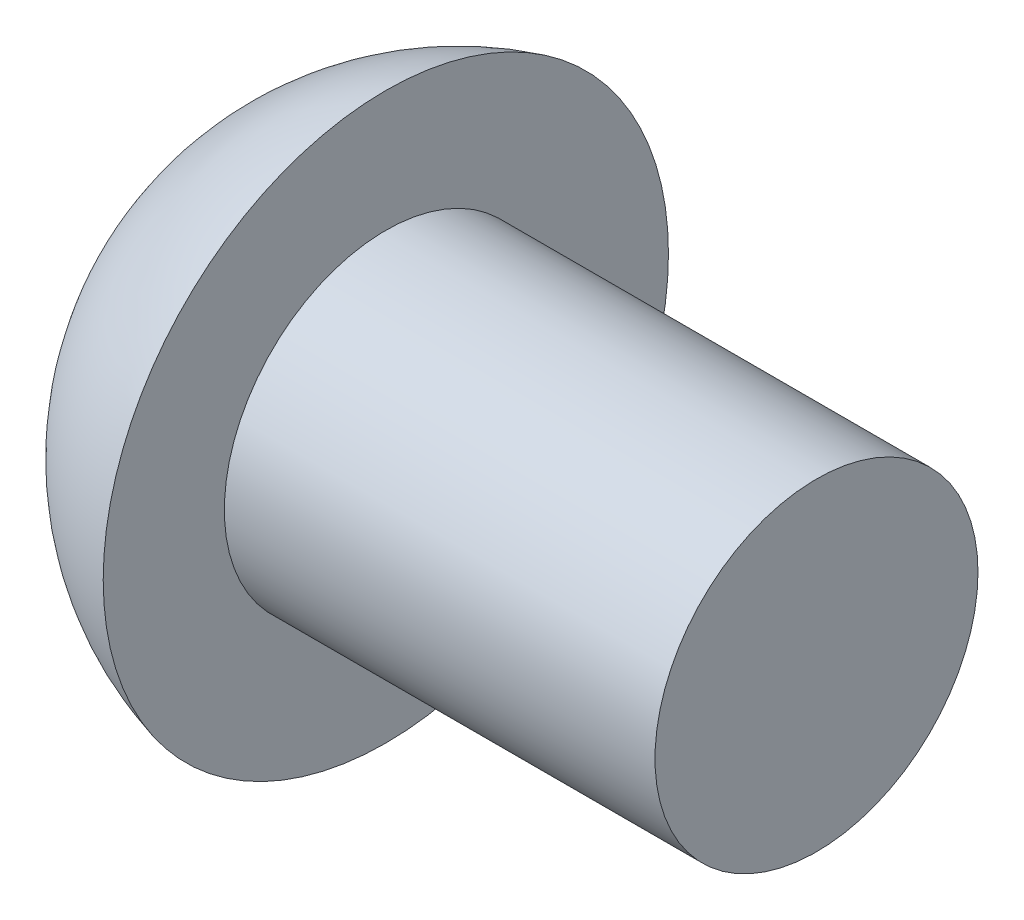
ISO-10303-21;
HEADER;
FILE_DESCRIPTION(('STEP AP214'),'2;1');
FILE_NAME('part.step','',(''),(''),'','','');
FILE_SCHEMA(('AUTOMOTIVE_DESIGN { 1 0 10303 214 1 1 1 1 }'));
ENDSEC;
DATA;
#1=APPLICATION_CONTEXT('core data for automotive mechanical design processes');
#2=APPLICATION_PROTOCOL_DEFINITION('international standard','automotive_design',2000,#1);
#3=PRODUCT_CONTEXT('',#1,'mechanical');
#4=PRODUCT('Part','Part','',(#3));
#5=PRODUCT_RELATED_PRODUCT_CATEGORY('part','',(#4));
#6=PRODUCT_DEFINITION_FORMATION('','',#4);
#7=PRODUCT_DEFINITION_CONTEXT('part definition',#1,'design');
#8=PRODUCT_DEFINITION('design','',#6,#7);
#9=PRODUCT_DEFINITION_SHAPE('','',#8);
#10=(LENGTH_UNIT() NAMED_UNIT(*) SI_UNIT(.MILLI.,.METRE.));
#11=(NAMED_UNIT(*) PLANE_ANGLE_UNIT() SI_UNIT($,.RADIAN.));
#12=(NAMED_UNIT(*) SI_UNIT($,.STERADIAN.) SOLID_ANGLE_UNIT());
#13=UNCERTAINTY_MEASURE_WITH_UNIT(LENGTH_MEASURE(1.E-05),#10,'distance_accuracy_value','');
#14=(GEOMETRIC_REPRESENTATION_CONTEXT(3) GLOBAL_UNCERTAINTY_ASSIGNED_CONTEXT((#13)) GLOBAL_UNIT_ASSIGNED_CONTEXT((#10,
#11,#12)) REPRESENTATION_CONTEXT('',''));
#15=CARTESIAN_POINT('',(0.,0.,0.));
#16=DIRECTION('',(0.,0.,1.));
#17=DIRECTION('',(1.,0.,0.));
#18=AXIS2_PLACEMENT_3D('',#15,#16,#17);
#19=CARTESIAN_POINT('',(13.3,0.,0.));
#20=DIRECTION('',(-1.,0.,0.));
#21=DIRECTION('',(0.,0.,1.));
#22=AXIS2_PLACEMENT_3D('',#19,#20,#21);
#23=CYLINDRICAL_SURFACE('',#22,3.);
#24=CARTESIAN_POINT('',(3.3,0.,0.));
#25=DIRECTION('',(1.,0.,0.));
#26=DIRECTION('',(0.,0.,-1.));
#27=AXIS2_PLACEMENT_3D('',#24,#25,#26);
#28=CIRCLE('',#27,3.);
#29=CARTESIAN_POINT('',(3.3,0.,-3.));
#30=VERTEX_POINT('',#29);
#31=EDGE_CURVE('E11',#30,#30,#28,.T.);
#32=ORIENTED_EDGE('',*,*,#31,.T.);
#33=EDGE_LOOP('',(#32));
#34=FACE_BOUND('',#33,.T.);
#35=CARTESIAN_POINT('',(11.3,0.,0.));
#36=DIRECTION('',(1.,0.,0.));
#37=DIRECTION('',(0.,0.,-1.));
#38=AXIS2_PLACEMENT_3D('',#35,#36,#37);
#39=CIRCLE('',#38,3.);
#40=CARTESIAN_POINT('',(11.3,0.,-3.));
#41=VERTEX_POINT('',#40);
#42=EDGE_CURVE('E148',#41,#41,#39,.T.);
#43=ORIENTED_EDGE('',*,*,#42,.F.);
#44=EDGE_LOOP('',(#43));
#45=FACE_BOUND('',#44,.T.);
#46=ADVANCED_FACE('F38',(#34,#45),#23,.T.);
#47=CARTESIAN_POINT('',(0.,0.,0.));
#48=DIRECTION('',(1.,0.,0.));
#49=DIRECTION('',(0.,0.,-1.));
#50=AXIS2_PLACEMENT_3D('',#47,#48,#49);
#51=PLANE('',#50);
#52=CARTESIAN_POINT('',(0.,0.,0.));
#53=DIRECTION('',(-1.,0.,0.));
#54=DIRECTION('',(0.,0.,1.));
#55=AXIS2_PLACEMENT_3D('',#52,#53,#54);
#56=CIRCLE('',#55,2.79);
#57=CARTESIAN_POINT('',(0.,2.79,0.));
#58=VERTEX_POINT('',#57);
#59=EDGE_CURVE('E127',#58,#58,#56,.T.);
#60=ORIENTED_EDGE('',*,*,#59,.T.);
#61=EDGE_LOOP('',(#60));
#62=FACE_BOUND('',#61,.T.);
#63=DIRECTION('',(0.,0.866025403784439,-0.5));
#64=VECTOR('',#63,1.);
#65=CARTESIAN_POINT('',(0.,-2.,-1.15470053837925));
#66=LINE('',#65,#64);
#67=CARTESIAN_POINT('',(0.,-2.,-1.15470053837925));
#68=VERTEX_POINT('',#67);
#69=CARTESIAN_POINT('',(0.,0.,-2.3094010767585));
#70=VERTEX_POINT('',#69);
#71=EDGE_CURVE('E53',#68,#70,#66,.T.);
#72=ORIENTED_EDGE('',*,*,#71,.T.);
#73=DIRECTION('',(0.,0.866025403784438,0.5));
#74=VECTOR('',#73,1.);
#75=CARTESIAN_POINT('',(0.,0.,-2.3094010767585));
#76=LINE('',#75,#74);
#77=CARTESIAN_POINT('',(0.,2.,-1.15470053837925));
#78=VERTEX_POINT('',#77);
#79=EDGE_CURVE('E112',#70,#78,#76,.T.);
#80=ORIENTED_EDGE('',*,*,#79,.T.);
#81=DIRECTION('',(0.,0.,1.));
#82=VECTOR('',#81,1.);
#83=CARTESIAN_POINT('',(0.,2.,-1.15470053837925));
#84=LINE('',#83,#82);
#85=CARTESIAN_POINT('',(0.,2.,1.15470053837925));
#86=VERTEX_POINT('',#85);
#87=EDGE_CURVE('E110',#78,#86,#84,.T.);
#88=ORIENTED_EDGE('',*,*,#87,.T.);
#89=DIRECTION('',(0.,-0.866025403784439,0.5));
#90=VECTOR('',#89,1.);
#91=CARTESIAN_POINT('',(0.,2.,1.15470053837925));
#92=LINE('',#91,#90);
#93=CARTESIAN_POINT('',(0.,0.,2.3094010767585));
#94=VERTEX_POINT('',#93);
#95=EDGE_CURVE('E89',#86,#94,#92,.T.);
#96=ORIENTED_EDGE('',*,*,#95,.T.);
#97=DIRECTION('',(0.,-0.866025403784439,-0.5));
#98=VECTOR('',#97,1.);
#99=CARTESIAN_POINT('',(0.,0.,2.3094010767585));
#100=LINE('',#99,#98);
#101=CARTESIAN_POINT('',(0.,-2.,1.15470053837925));
#102=VERTEX_POINT('',#101);
#103=EDGE_CURVE('E100',#94,#102,#100,.T.);
#104=ORIENTED_EDGE('',*,*,#103,.T.);
#105=DIRECTION('',(0.,0.,-1.));
#106=VECTOR('',#105,1.);
#107=CARTESIAN_POINT('',(0.,-2.,1.15470053837925));
#108=LINE('',#107,#106);
#109=EDGE_CURVE('E106',#102,#68,#108,.T.);
#110=ORIENTED_EDGE('',*,*,#109,.T.);
#111=EDGE_LOOP('',(#72,#80,#88,#96,#104,#110));
#112=FACE_BOUND('',#111,.T.);
#113=ADVANCED_FACE('F40',(#62,#112),#51,.F.);
#114=CARTESIAN_POINT('',(3.3,0.,0.));
#115=DIRECTION('',(1.,0.,0.));
#116=DIRECTION('',(0.,0.,-1.));
#117=AXIS2_PLACEMENT_3D('',#114,#115,#116);
#118=PLANE('',#117);
#119=CARTESIAN_POINT('',(3.3,0.,0.));
#120=DIRECTION('',(-1.,0.,0.));
#121=DIRECTION('',(0.,0.,1.));
#122=AXIS2_PLACEMENT_3D('',#119,#120,#121);
#123=CIRCLE('',#122,5.25);
#124=CARTESIAN_POINT('',(3.3,5.25,0.));
#125=VERTEX_POINT('',#124);
#126=EDGE_CURVE('E46',#125,#125,#123,.T.);
#127=ORIENTED_EDGE('',*,*,#126,.F.);
#128=EDGE_LOOP('',(#127));
#129=FACE_BOUND('',#128,.T.);
#130=ORIENTED_EDGE('',*,*,#31,.F.);
#131=EDGE_LOOP('',(#130));
#132=FACE_BOUND('',#131,.T.);
#133=ADVANCED_FACE('F138',(#129,#132),#118,.T.);
#134=CARTESIAN_POINT('',(4.64672727272727,0.,0.));
#135=DIRECTION('',(-1.,0.,0.));
#136=DIRECTION('',(0.,1.,0.));
#137=AXIS2_PLACEMENT_3D('',#134,#135,#136);
#138=SPHERICAL_SURFACE('',#137,5.41997918327252);
#139=CARTESIAN_POINT('',(3.3,5.25,0.));
#140=CARTESIAN_POINT('',(3.25740053994417,5.23907252619472,0.));
#141=CARTESIAN_POINT('',(3.2149341426337,5.22762634797157,0.));
#142=CARTESIAN_POINT('',(3.13029250003967,5.203703846289,0.));
#143=CARTESIAN_POINT('',(3.08811725475612,5.19122752282958,0.));
#144=CARTESIAN_POINT('',(3.00408294275212,5.16525199427393,0.));
#145=CARTESIAN_POINT('',(2.96222387603168,5.1517527891777,0.));
#146=CARTESIAN_POINT('',(2.87884671411939,5.12373953058941,0.));
#147=CARTESIAN_POINT('',(2.83732861892754,5.10922547709734,0.));
#148=CARTESIAN_POINT('',(2.75465800338832,5.07919111246186,0.));
#149=CARTESIAN_POINT('',(2.71350548304094,5.06367080131845,0.));
#150=CARTESIAN_POINT('',(2.6315904005738,5.03163312010483,0.));
#151=CARTESIAN_POINT('',(2.59082783845403,5.01511575003462,0.));
#152=CARTESIAN_POINT('',(2.50971682565274,4.98109373733238,0.));
#153=CARTESIAN_POINT('',(2.46936837497122,4.96358909470035,0.));
#154=CARTESIAN_POINT('',(2.38910949264551,4.92760290907071,0.));
#155=CARTESIAN_POINT('',(2.34919906100133,4.9091213660731,0.));
#156=CARTESIAN_POINT('',(2.26983986487403,4.87119233052498,0.));
#157=CARTESIAN_POINT('',(2.2303911003909,4.85174483797446,0.));
#158=CARTESIAN_POINT('',(2.15197861314088,4.81189542654739,0.));
#159=CARTESIAN_POINT('',(2.11301489037399,4.79149350767083,0.));
#160=CARTESIAN_POINT('',(2.03559557371463,4.74974733232811,0.));
#161=CARTESIAN_POINT('',(1.99713997982217,4.72840307586196,0.));
#162=CARTESIAN_POINT('',(1.92075970698728,4.6847848724437,0.));
#163=CARTESIAN_POINT('',(1.88283502804485,4.6625109254916,0.));
#164=CARTESIAN_POINT('',(1.80753905660316,4.61704653907306,0.));
#165=CARTESIAN_POINT('',(1.7701677641039,4.59385609960661,0.));
#166=CARTESIAN_POINT('',(1.69600070914377,4.54657246918017,0.));
#167=CARTESIAN_POINT('',(1.6592049466829,4.52247927822017,0.));
#168=CARTESIAN_POINT('',(1.58621075437624,4.47340442073426,0.));
#169=CARTESIAN_POINT('',(1.55001232453045,4.44842275420836,0.));
#170=CARTESIAN_POINT('',(1.4782342460934,4.39758574796637,0.));
#171=CARTESIAN_POINT('',(1.44265459750215,4.37173040825027,0.));
#172=CARTESIAN_POINT('',(1.37213516356745,4.31916137568077,0.));
#173=CARTESIAN_POINT('',(1.33719537822401,4.29244768282736,0.));
#174=CARTESIAN_POINT('',(1.26797637364033,4.23817777263573,0.));
#175=CARTESIAN_POINT('',(1.23369715440009,4.2106215552975,0.));
#176=CARTESIAN_POINT('',(1.16581959347328,4.15468292400936,0.));
#177=CARTESIAN_POINT('',(1.13222125178671,4.12630051005945,0.));
#178=CARTESIAN_POINT('',(1.06572535397759,4.068726302967,0.));
#179=CARTESIAN_POINT('',(1.03282779785505,4.03953450982447,0.));
#180=CARTESIAN_POINT('',(0.96775296394828,3.98035884134689,0.));
#181=CARTESIAN_POINT('',(0.935575686164053,3.95037496601184,0.));
#182=CARTESIAN_POINT('',(0.87196047492172,3.88963289948162,0.));
#183=CARTESIAN_POINT('',(0.840522541463614,3.85887470828645,0.));
#184=CARTESIAN_POINT('',(0.778404646778992,3.79660223517274,0.));
#185=CARTESIAN_POINT('',(0.747724685552474,3.76508795325421,0.));
#186=CARTESIAN_POINT('',(0.687140914111733,3.70132197183908,0.));
#187=CARTESIAN_POINT('',(0.65723710389751,3.66907027234248,0.));
#188=CARTESIAN_POINT('',(0.598223353383882,3.60384856584918,0.));
#189=CARTESIAN_POINT('',(0.569113413084478,3.57087855885248,0.));
#190=CARTESIAN_POINT('',(0.511704650858507,3.50423977308906,0.));
#191=CARTESIAN_POINT('',(0.483405828931941,3.47057099432233,0.));
#192=CARTESIAN_POINT('',(0.427636071496316,3.40255461466614,0.));
#193=CARTESIAN_POINT('',(0.400165135987258,3.36820701377669,0.));
#194=CARTESIAN_POINT('',(0.346067428144233,3.29885334221364,0.));
#195=CARTESIAN_POINT('',(0.319440655810267,3.26384727154004,0.));
#196=CARTESIAN_POINT('',(0.267047053644793,3.19319740115929,0.));
#197=CARTESIAN_POINT('',(0.241280223813286,3.15755360145213,0.));
#198=CARTESIAN_POINT('',(0.190621766133018,3.08564939816234,0.));
#199=CARTESIAN_POINT('',(0.165730138284258,3.04938899457971,0.));
#200=CARTESIAN_POINT('',(0.116836863928256,2.97627304966699,0.));
#201=CARTESIAN_POINT('',(0.0928352174210134,2.93941750833691,0.));
#202=CARTESIAN_POINT('',(0.0457360142262078,2.86513319770417,0.));
#203=CARTESIAN_POINT('',(0.0226384575386445,2.82770442840151,0.));
#204=CARTESIAN_POINT('',(0.,2.79,0.));
#205=B_SPLINE_CURVE_WITH_KNOTS('',3,(#139,#140,#141,#142,#143,#144,#145,#146,#147,#148,#149,
#150,#151,#152,#153,#154,#155,#156,#157,#158,#159,#160,#161,#162,#163,#164,#165,#166,#167,#168,
#169,#170,#171,#172,#173,#174,#175,#176,#177,#178,#179,#180,#181,#182,#183,#184,#185,#186,#187,
#188,#189,#190,#191,#192,#193,#194,#195,#196,#197,#198,#199,#200,#201,#202,#203,#204),
.UNSPECIFIED.,.F.,.F.,(4,2,2,2,2,2,2,2,2,2,2,2,2,2,2,2,2,2,2,2,2,2,2,2,2,2,2,2,2,2,2,2,4),(0.,
0.131932753537336,0.263865507074671,0.395798260612006,0.527731014149342,0.659663767686677,
0.791596521224013,0.923529274761348,1.05546202829868,1.18739478183602,1.31932753537335,
1.45126028891069,1.58319304244803,1.71512579598536,1.8470585495227,1.97899130306003,
2.11092405659737,2.2428568101347,2.37478956367204,2.50672231720937,2.63865507074671,
2.77058782428405,2.90252057782138,3.03445333135872,3.16638608489605,3.29831883843339,
3.43025159197072,3.56218434550806,3.69411709904539,3.82604985258273,3.95798260612007,
4.0899153596574,4.22184811319474),.UNSPECIFIED.);
#206=EDGE_CURVE('BSEAM135',#125,#58,#205,.T.);
#207=ORIENTED_EDGE('',*,*,#126,.T.);
#208=ORIENTED_EDGE('',*,*,#59,.F.);
#209=ORIENTED_EDGE('',*,*,#206,.T.);
#210=ORIENTED_EDGE('',*,*,#206,.F.);
#211=EDGE_LOOP('',(#207,#209,#208,#210));
#212=FACE_BOUND('',#211,.T.);
#213=ADVANCED_FACE('F135',(#212),#138,.T.);
#214=CARTESIAN_POINT('',(2.08,-2.,-1.15470053837925));
#215=DIRECTION('',(0.,0.5,0.866025403784439));
#216=DIRECTION('',(0.,-0.866025403784439,0.5));
#217=AXIS2_PLACEMENT_3D('',#214,#215,#216);
#218=PLANE('',#217);
#219=ORIENTED_EDGE('',*,*,#71,.F.);
#220=DIRECTION('',(-1.,0.,0.));
#221=VECTOR('',#220,1.);
#222=CARTESIAN_POINT('',(2.08,-2.,-1.15470053837925));
#223=LINE('',#222,#221);
#224=CARTESIAN_POINT('',(2.08,-2.,-1.15470053837925));
#225=VERTEX_POINT('',#224);
#226=EDGE_CURVE('E118',#225,#68,#223,.T.);
#227=ORIENTED_EDGE('',*,*,#226,.F.);
#228=DIRECTION('',(0.,0.866025403784439,-0.5));
#229=VECTOR('',#228,1.);
#230=CARTESIAN_POINT('',(2.08,-2.,-1.15470053837925));
#231=LINE('',#230,#229);
#232=CARTESIAN_POINT('',(2.08,0.,-2.3094010767585));
#233=VERTEX_POINT('',#232);
#234=EDGE_CURVE('E117',#225,#233,#231,.T.);
#235=ORIENTED_EDGE('',*,*,#234,.T.);
#236=DIRECTION('',(-1.,0.,0.));
#237=VECTOR('',#236,1.);
#238=CARTESIAN_POINT('',(2.08,0.,-2.3094010767585));
#239=LINE('',#238,#237);
#240=EDGE_CURVE('E125',#233,#70,#239,.T.);
#241=ORIENTED_EDGE('',*,*,#240,.T.);
#242=EDGE_LOOP('',(#219,#227,#235,#241));
#243=FACE_BOUND('',#242,.T.);
#244=ADVANCED_FACE('F184',(#243),#218,.T.);
#245=CARTESIAN_POINT('',(2.08,0.,-2.3094010767585));
#246=DIRECTION('',(0.,-0.5,0.866025403784439));
#247=DIRECTION('',(0.,-0.866025403784438,-0.5));
#248=AXIS2_PLACEMENT_3D('',#245,#246,#247);
#249=PLANE('',#248);
#250=ORIENTED_EDGE('',*,*,#79,.F.);
#251=ORIENTED_EDGE('',*,*,#240,.F.);
#252=DIRECTION('',(0.,0.866025403784438,0.5));
#253=VECTOR('',#252,1.);
#254=CARTESIAN_POINT('',(2.08,0.,-2.3094010767585));
#255=LINE('',#254,#253);
#256=CARTESIAN_POINT('',(2.08,2.,-1.15470053837925));
#257=VERTEX_POINT('',#256);
#258=EDGE_CURVE('E170',#233,#257,#255,.T.);
#259=ORIENTED_EDGE('',*,*,#258,.T.);
#260=DIRECTION('',(-1.,0.,0.));
#261=VECTOR('',#260,1.);
#262=CARTESIAN_POINT('',(2.08,2.,-1.15470053837925));
#263=LINE('',#262,#261);
#264=EDGE_CURVE('E123',#257,#78,#263,.T.);
#265=ORIENTED_EDGE('',*,*,#264,.T.);
#266=EDGE_LOOP('',(#250,#251,#259,#265));
#267=FACE_BOUND('',#266,.T.);
#268=ADVANCED_FACE('F181',(#267),#249,.T.);
#269=CARTESIAN_POINT('',(2.08,2.,-1.15470053837925));
#270=DIRECTION('',(0.,-1.,0.));
#271=DIRECTION('',(0.,0.,-1.));
#272=AXIS2_PLACEMENT_3D('',#269,#270,#271);
#273=PLANE('',#272);
#274=ORIENTED_EDGE('',*,*,#87,.F.);
#275=ORIENTED_EDGE('',*,*,#264,.F.);
#276=DIRECTION('',(0.,0.,1.));
#277=VECTOR('',#276,1.);
#278=CARTESIAN_POINT('',(2.08,2.,-1.15470053837925));
#279=LINE('',#278,#277);
#280=CARTESIAN_POINT('',(2.08,2.,1.15470053837925));
#281=VERTEX_POINT('',#280);
#282=EDGE_CURVE('E62',#257,#281,#279,.T.);
#283=ORIENTED_EDGE('',*,*,#282,.T.);
#284=DIRECTION('',(-1.,0.,0.));
#285=VECTOR('',#284,1.);
#286=CARTESIAN_POINT('',(2.08,2.,1.15470053837925));
#287=LINE('',#286,#285);
#288=EDGE_CURVE('E96',#281,#86,#287,.T.);
#289=ORIENTED_EDGE('',*,*,#288,.T.);
#290=EDGE_LOOP('',(#274,#275,#283,#289));
#291=FACE_BOUND('',#290,.T.);
#292=ADVANCED_FACE('F213',(#291),#273,.T.);
#293=CARTESIAN_POINT('',(2.08,2.,1.15470053837925));
#294=DIRECTION('',(0.,-0.5,-0.866025403784439));
#295=DIRECTION('',(0.,0.866025403784439,-0.5));
#296=AXIS2_PLACEMENT_3D('',#293,#294,#295);
#297=PLANE('',#296);
#298=ORIENTED_EDGE('',*,*,#95,.F.);
#299=ORIENTED_EDGE('',*,*,#288,.F.);
#300=DIRECTION('',(0.,-0.866025403784439,0.5));
#301=VECTOR('',#300,1.);
#302=CARTESIAN_POINT('',(2.08,2.,1.15470053837925));
#303=LINE('',#302,#301);
#304=CARTESIAN_POINT('',(2.08,0.,2.3094010767585));
#305=VERTEX_POINT('',#304);
#306=EDGE_CURVE('E93',#281,#305,#303,.T.);
#307=ORIENTED_EDGE('',*,*,#306,.T.);
#308=DIRECTION('',(-1.,0.,0.));
#309=VECTOR('',#308,1.);
#310=CARTESIAN_POINT('',(2.08,0.,2.3094010767585));
#311=LINE('',#310,#309);
#312=EDGE_CURVE('E84',#305,#94,#311,.T.);
#313=ORIENTED_EDGE('',*,*,#312,.T.);
#314=EDGE_LOOP('',(#298,#299,#307,#313));
#315=FACE_BOUND('',#314,.T.);
#316=ADVANCED_FACE('F86',(#315),#297,.T.);
#317=CARTESIAN_POINT('',(2.08,0.,2.3094010767585));
#318=DIRECTION('',(0.,0.5,-0.866025403784439));
#319=DIRECTION('',(0.,0.866025403784439,0.5));
#320=AXIS2_PLACEMENT_3D('',#317,#318,#319);
#321=PLANE('',#320);
#322=ORIENTED_EDGE('',*,*,#103,.F.);
#323=ORIENTED_EDGE('',*,*,#312,.F.);
#324=DIRECTION('',(0.,-0.866025403784439,-0.5));
#325=VECTOR('',#324,1.);
#326=CARTESIAN_POINT('',(2.08,0.,2.3094010767585));
#327=LINE('',#326,#325);
#328=CARTESIAN_POINT('',(2.08,-2.,1.15470053837925));
#329=VERTEX_POINT('',#328);
#330=EDGE_CURVE('E175',#305,#329,#327,.T.);
#331=ORIENTED_EDGE('',*,*,#330,.T.);
#332=DIRECTION('',(-1.,0.,0.));
#333=VECTOR('',#332,1.);
#334=CARTESIAN_POINT('',(2.08,-2.,1.15470053837925));
#335=LINE('',#334,#333);
#336=EDGE_CURVE('E97',#329,#102,#335,.T.);
#337=ORIENTED_EDGE('',*,*,#336,.T.);
#338=EDGE_LOOP('',(#322,#323,#331,#337));
#339=FACE_BOUND('',#338,.T.);
#340=ADVANCED_FACE('F101',(#339),#321,.T.);
#341=CARTESIAN_POINT('',(2.08,-2.,1.15470053837925));
#342=DIRECTION('',(0.,1.,0.));
#343=DIRECTION('',(0.,0.,1.));
#344=AXIS2_PLACEMENT_3D('',#341,#342,#343);
#345=PLANE('',#344);
#346=ORIENTED_EDGE('',*,*,#109,.F.);
#347=ORIENTED_EDGE('',*,*,#336,.F.);
#348=DIRECTION('',(0.,0.,-1.));
#349=VECTOR('',#348,1.);
#350=CARTESIAN_POINT('',(2.08,-2.,1.15470053837925));
#351=LINE('',#350,#349);
#352=EDGE_CURVE('E120',#329,#225,#351,.T.);
#353=ORIENTED_EDGE('',*,*,#352,.T.);
#354=ORIENTED_EDGE('',*,*,#226,.T.);
#355=EDGE_LOOP('',(#346,#347,#353,#354));
#356=FACE_BOUND('',#355,.T.);
#357=ADVANCED_FACE('F198',(#356),#345,.T.);
#358=CARTESIAN_POINT('',(2.08,0.,2.3094010767585));
#359=DIRECTION('',(0.86602540378444,-0.249999999999999,0.433012701892218));
#360=DIRECTION('',(0.447213595499956,0.,-0.894427190999917));
#361=AXIS2_PLACEMENT_3D('',#358,#359,#360);
#362=PLANE('',#361);
#363=ORIENTED_EDGE('',*,*,#330,.F.);
#364=DIRECTION('',(-0.447213595499956,0.,0.894427190999917));
#365=VECTOR('',#364,1.);
#366=CARTESIAN_POINT('',(2.08,0.,2.3094010767585));
#367=LINE('',#366,#365);
#368=CARTESIAN_POINT('',(3.23470053837925,0.,0.));
#369=VERTEX_POINT('',#368);
#370=EDGE_CURVE('E150',#369,#305,#367,.T.);
#371=ORIENTED_EDGE('',*,*,#370,.F.);
#372=DIRECTION('',(-0.447213595499956,-0.774596669241484,0.447213595499958));
#373=VECTOR('',#372,1.);
#374=CARTESIAN_POINT('',(2.08,-2.,1.15470053837925));
#375=LINE('',#374,#373);
#376=EDGE_CURVE('E156',#369,#329,#375,.T.);
#377=ORIENTED_EDGE('',*,*,#376,.T.);
#378=EDGE_LOOP('',(#363,#371,#377));
#379=FACE_BOUND('',#378,.T.);
#380=ADVANCED_FACE('F205',(#379),#362,.F.);
#381=CARTESIAN_POINT('',(2.08,-2.,1.15470053837925));
#382=DIRECTION('',(0.86602540378444,-0.499999999999998,0.));
#383=DIRECTION('',(0.499999999999998,0.86602540378444,0.));
#384=AXIS2_PLACEMENT_3D('',#381,#382,#383);
#385=PLANE('',#384);
#386=ORIENTED_EDGE('',*,*,#352,.F.);
#387=ORIENTED_EDGE('',*,*,#376,.F.);
#388=DIRECTION('',(-0.447213595499956,-0.774596669241484,-0.447213595499958));
#389=VECTOR('',#388,1.);
#390=CARTESIAN_POINT('',(2.08,-2.,-1.15470053837925));
#391=LINE('',#390,#389);
#392=EDGE_CURVE('E158',#369,#225,#391,.T.);
#393=ORIENTED_EDGE('',*,*,#392,.T.);
#394=EDGE_LOOP('',(#386,#387,#393));
#395=FACE_BOUND('',#394,.T.);
#396=ADVANCED_FACE('F201',(#395),#385,.F.);
#397=CARTESIAN_POINT('',(2.08,-2.,-1.15470053837925));
#398=DIRECTION('',(0.86602540378444,-0.249999999999999,-0.433012701892218));
#399=DIRECTION('',(-0.447213595499956,0.,-0.894427190999917));
#400=AXIS2_PLACEMENT_3D('',#397,#398,#399);
#401=PLANE('',#400);
#402=ORIENTED_EDGE('',*,*,#234,.F.);
#403=ORIENTED_EDGE('',*,*,#392,.F.);
#404=DIRECTION('',(-0.447213595499956,0.,-0.894427190999917));
#405=VECTOR('',#404,1.);
#406=CARTESIAN_POINT('',(2.08,0.,-2.3094010767585));
#407=LINE('',#406,#405);
#408=EDGE_CURVE('E163',#369,#233,#407,.T.);
#409=ORIENTED_EDGE('',*,*,#408,.T.);
#410=EDGE_LOOP('',(#402,#403,#409));
#411=FACE_BOUND('',#410,.T.);
#412=ADVANCED_FACE('F191',(#411),#401,.F.);
#413=CARTESIAN_POINT('',(2.08,0.,-2.3094010767585));
#414=DIRECTION('',(0.86602540378444,0.249999999999999,-0.433012701892217));
#415=DIRECTION('',(-0.447213595499956,0.,-0.894427190999917));
#416=AXIS2_PLACEMENT_3D('',#413,#414,#415);
#417=PLANE('',#416);
#418=ORIENTED_EDGE('',*,*,#258,.F.);
#419=ORIENTED_EDGE('',*,*,#408,.F.);
#420=DIRECTION('',(-0.447213595499956,0.774596669241484,-0.447213595499958));
#421=VECTOR('',#420,1.);
#422=CARTESIAN_POINT('',(2.08,2.,-1.15470053837925));
#423=LINE('',#422,#421);
#424=EDGE_CURVE('E161',#369,#257,#423,.T.);
#425=ORIENTED_EDGE('',*,*,#424,.T.);
#426=EDGE_LOOP('',(#418,#419,#425));
#427=FACE_BOUND('',#426,.T.);
#428=ADVANCED_FACE('F291',(#427),#417,.F.);
#429=CARTESIAN_POINT('',(2.08,2.,-1.15470053837925));
#430=DIRECTION('',(0.86602540378444,0.499999999999998,0.));
#431=DIRECTION('',(-0.499999999999998,0.86602540378444,0.));
#432=AXIS2_PLACEMENT_3D('',#429,#430,#431);
#433=PLANE('',#432);
#434=ORIENTED_EDGE('',*,*,#282,.F.);
#435=ORIENTED_EDGE('',*,*,#424,.F.);
#436=DIRECTION('',(-0.447213595499956,0.774596669241484,0.447213595499958));
#437=VECTOR('',#436,1.);
#438=CARTESIAN_POINT('',(2.08,2.,1.15470053837925));
#439=LINE('',#438,#437);
#440=EDGE_CURVE('E153',#369,#281,#439,.T.);
#441=ORIENTED_EDGE('',*,*,#440,.T.);
#442=EDGE_LOOP('',(#434,#435,#441));
#443=FACE_BOUND('',#442,.T.);
#444=ADVANCED_FACE('F210',(#443),#433,.F.);
#445=CARTESIAN_POINT('',(2.08,2.,1.15470053837925));
#446=DIRECTION('',(0.86602540378444,0.249999999999999,0.433012701892218));
#447=DIRECTION('',(0.447213595499956,0.,-0.894427190999917));
#448=AXIS2_PLACEMENT_3D('',#445,#446,#447);
#449=PLANE('',#448);
#450=ORIENTED_EDGE('',*,*,#306,.F.);
#451=ORIENTED_EDGE('',*,*,#440,.F.);
#452=ORIENTED_EDGE('',*,*,#370,.T.);
#453=EDGE_LOOP('',(#450,#451,#452));
#454=FACE_BOUND('',#453,.T.);
#455=ADVANCED_FACE('F211',(#454),#449,.F.);
#456=CARTESIAN_POINT('',(11.3,0.,0.));
#457=DIRECTION('',(1.,0.,0.));
#458=DIRECTION('',(0.,0.,-1.));
#459=AXIS2_PLACEMENT_3D('',#456,#457,#458);
#460=PLANE('',#459);
#461=ORIENTED_EDGE('',*,*,#42,.T.);
#462=EDGE_LOOP('',(#461));
#463=FACE_BOUND('',#462,.T.);
#464=ADVANCED_FACE('F317',(#463),#460,.T.);
#465=CLOSED_SHELL('',(#46,#113,#133,#213,#244,#268,#292,#316,#340,#357,#380,#396,#412,#428,#444,
#455,#464));
#466=MANIFOLD_SOLID_BREP('B2',#465);
#467=ADVANCED_BREP_SHAPE_REPRESENTATION('',(#18,#466),#14);
#468=SHAPE_DEFINITION_REPRESENTATION(#9,#467);
ENDSEC;
END-ISO-10303-21;
